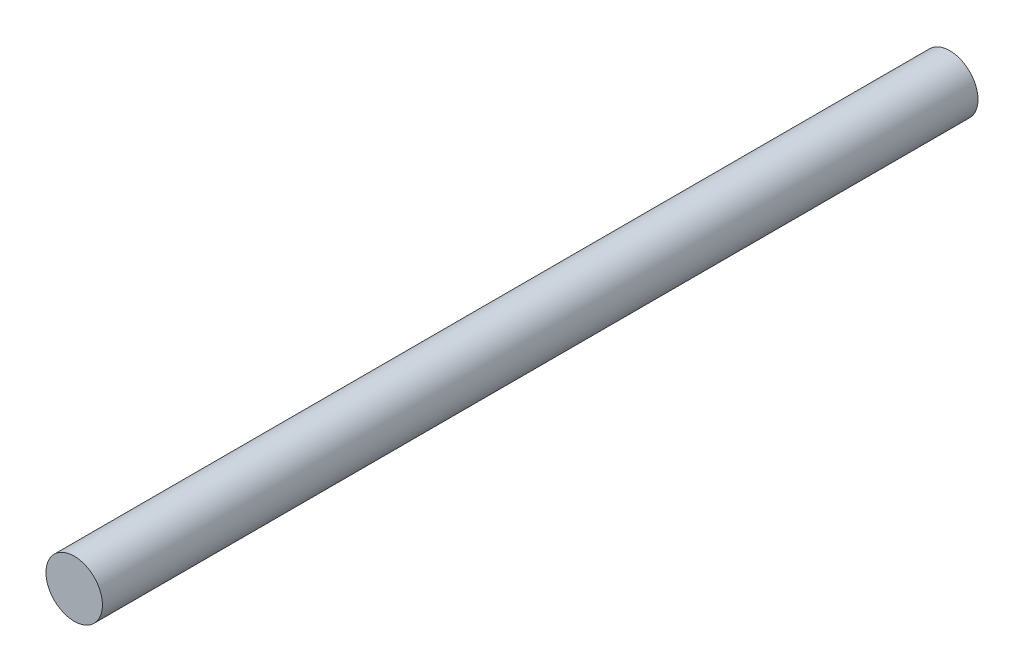
ISO-10303-21;
HEADER;
FILE_DESCRIPTION(('STEP AP214'),'2;1');
FILE_NAME('part.step','',(''),(''),'','','');
FILE_SCHEMA(('AUTOMOTIVE_DESIGN { 1 0 10303 214 1 1 1 1 }'));
ENDSEC;
DATA;
#1=APPLICATION_CONTEXT('core data for automotive mechanical design processes');
#2=APPLICATION_PROTOCOL_DEFINITION('international standard','automotive_design',2000,#1);
#3=PRODUCT_CONTEXT('',#1,'mechanical');
#4=PRODUCT('Part','Part','',(#3));
#5=PRODUCT_RELATED_PRODUCT_CATEGORY('part','',(#4));
#6=PRODUCT_DEFINITION_FORMATION('','',#4);
#7=PRODUCT_DEFINITION_CONTEXT('part definition',#1,'design');
#8=PRODUCT_DEFINITION('design','',#6,#7);
#9=PRODUCT_DEFINITION_SHAPE('','',#8);
#10=(LENGTH_UNIT() NAMED_UNIT(*) SI_UNIT(.MILLI.,.METRE.));
#11=(NAMED_UNIT(*) PLANE_ANGLE_UNIT() SI_UNIT($,.RADIAN.));
#12=(NAMED_UNIT(*) SI_UNIT($,.STERADIAN.) SOLID_ANGLE_UNIT());
#13=UNCERTAINTY_MEASURE_WITH_UNIT(LENGTH_MEASURE(1.E-05),#10,'distance_accuracy_value','');
#14=(GEOMETRIC_REPRESENTATION_CONTEXT(3) GLOBAL_UNCERTAINTY_ASSIGNED_CONTEXT((#13)) GLOBAL_UNIT_ASSIGNED_CONTEXT((#10,
#11,#12)) REPRESENTATION_CONTEXT('',''));
#15=CARTESIAN_POINT('',(0.,0.,0.));
#16=DIRECTION('',(0.,0.,1.));
#17=DIRECTION('',(1.,0.,0.));
#18=AXIS2_PLACEMENT_3D('',#15,#16,#17);
#19=CARTESIAN_POINT('',(0.,0.,62.));
#20=DIRECTION('',(0.,0.,-1.));
#21=DIRECTION('',(-1.,0.,0.));
#22=AXIS2_PLACEMENT_3D('',#19,#20,#21);
#23=CYLINDRICAL_SURFACE('',#22,2.);
#24=CARTESIAN_POINT('',(0.,0.,62.));
#25=DIRECTION('',(0.,0.,1.));
#26=DIRECTION('',(1.,0.,0.));
#27=AXIS2_PLACEMENT_3D('',#24,#25,#26);
#28=CIRCLE('',#27,2.);
#29=CARTESIAN_POINT('',(2.,0.,62.));
#30=VERTEX_POINT('',#29);
#31=EDGE_CURVE('E10',#30,#30,#28,.T.);
#32=ORIENTED_EDGE('',*,*,#31,.F.);
#33=EDGE_LOOP('',(#32));
#34=FACE_BOUND('',#33,.T.);
#35=CARTESIAN_POINT('',(0.,0.,0.));
#36=DIRECTION('',(0.,0.,1.));
#37=DIRECTION('',(1.,0.,0.));
#38=AXIS2_PLACEMENT_3D('',#35,#36,#37);
#39=CIRCLE('',#38,2.);
#40=CARTESIAN_POINT('',(2.,0.,0.));
#41=VERTEX_POINT('',#40);
#42=EDGE_CURVE('E38',#41,#41,#39,.T.);
#43=ORIENTED_EDGE('',*,*,#42,.T.);
#44=EDGE_LOOP('',(#43));
#45=FACE_BOUND('',#44,.T.);
#46=ADVANCED_FACE('F35',(#34,#45),#23,.T.);
#47=CARTESIAN_POINT('',(0.,0.,62.));
#48=DIRECTION('',(0.,0.,1.));
#49=DIRECTION('',(1.,0.,0.));
#50=AXIS2_PLACEMENT_3D('',#47,#48,#49);
#51=PLANE('',#50);
#52=ORIENTED_EDGE('',*,*,#31,.T.);
#53=EDGE_LOOP('',(#52));
#54=FACE_BOUND('',#53,.T.);
#55=ADVANCED_FACE('F50',(#54),#51,.T.);
#56=CARTESIAN_POINT('',(0.,0.,0.));
#57=DIRECTION('',(0.,0.,1.));
#58=DIRECTION('',(1.,0.,0.));
#59=AXIS2_PLACEMENT_3D('',#56,#57,#58);
#60=PLANE('',#59);
#61=ORIENTED_EDGE('',*,*,#42,.F.);
#62=EDGE_LOOP('',(#61));
#63=FACE_BOUND('',#62,.T.);
#64=ADVANCED_FACE('F48',(#63),#60,.F.);
#65=CLOSED_SHELL('',(#46,#55,#64));
#66=MANIFOLD_SOLID_BREP('B2',#65);
#67=ADVANCED_BREP_SHAPE_REPRESENTATION('',(#18,#66),#14);
#68=SHAPE_DEFINITION_REPRESENTATION(#9,#67);
ENDSEC;
END-ISO-10303-21;
